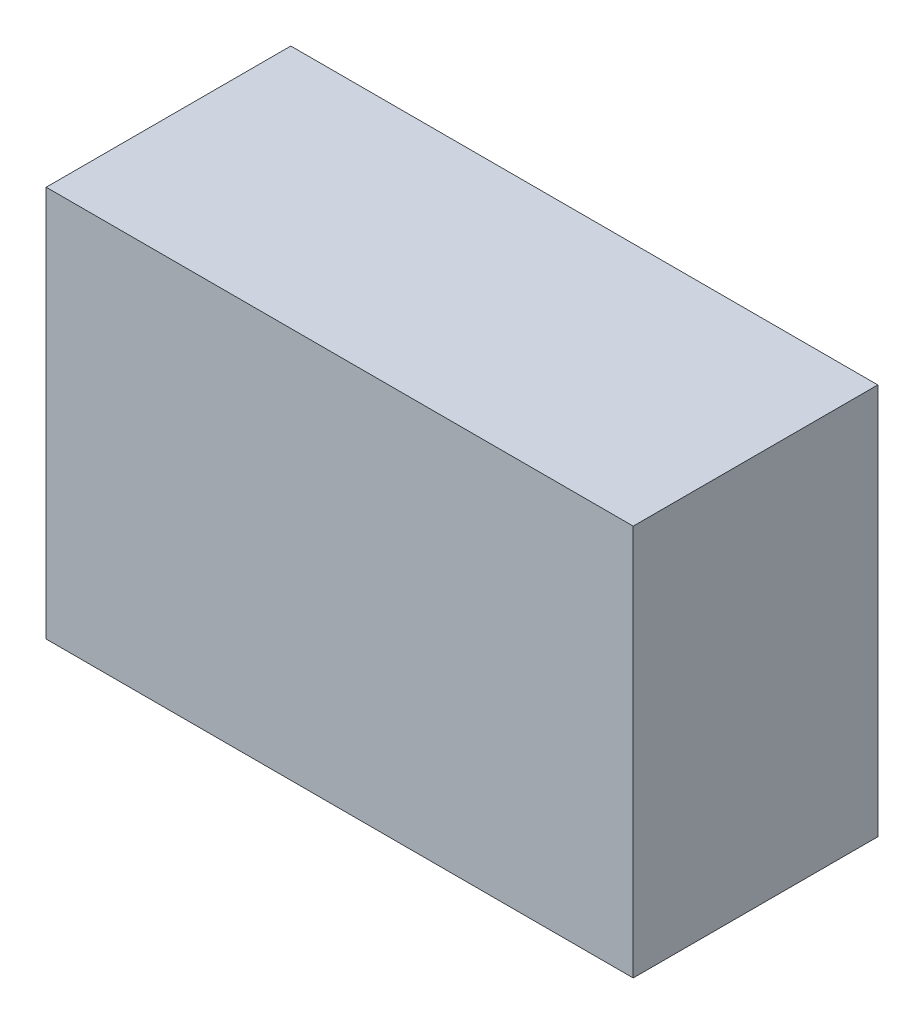
ISO-10303-21;
HEADER;
FILE_DESCRIPTION(('STEP AP214'),'2;1');
FILE_NAME('part.step','',(''),(''),'','','');
FILE_SCHEMA(('AUTOMOTIVE_DESIGN { 1 0 10303 214 1 1 1 1 }'));
ENDSEC;
DATA;
#1=APPLICATION_CONTEXT('core data for automotive mechanical design processes');
#2=APPLICATION_PROTOCOL_DEFINITION('international standard','automotive_design',2000,#1);
#3=PRODUCT_CONTEXT('',#1,'mechanical');
#4=PRODUCT('Part','Part','',(#3));
#5=PRODUCT_RELATED_PRODUCT_CATEGORY('part','',(#4));
#6=PRODUCT_DEFINITION_FORMATION('','',#4);
#7=PRODUCT_DEFINITION_CONTEXT('part definition',#1,'design');
#8=PRODUCT_DEFINITION('design','',#6,#7);
#9=PRODUCT_DEFINITION_SHAPE('','',#8);
#10=(LENGTH_UNIT() NAMED_UNIT(*) SI_UNIT(.MILLI.,.METRE.));
#11=(NAMED_UNIT(*) PLANE_ANGLE_UNIT() SI_UNIT($,.RADIAN.));
#12=(NAMED_UNIT(*) SI_UNIT($,.STERADIAN.) SOLID_ANGLE_UNIT());
#13=UNCERTAINTY_MEASURE_WITH_UNIT(LENGTH_MEASURE(1.E-05),#10,'distance_accuracy_value','');
#14=(GEOMETRIC_REPRESENTATION_CONTEXT(3) GLOBAL_UNCERTAINTY_ASSIGNED_CONTEXT((#13)) GLOBAL_UNIT_ASSIGNED_CONTEXT((#10,
#11,#12)) REPRESENTATION_CONTEXT('',''));
#15=CARTESIAN_POINT('',(0.,0.,0.));
#16=DIRECTION('',(0.,0.,1.));
#17=DIRECTION('',(1.,0.,0.));
#18=AXIS2_PLACEMENT_3D('',#15,#16,#17);
#19=CARTESIAN_POINT('',(0.,0.,25.));
#20=DIRECTION('',(-1.,0.,0.));
#21=DIRECTION('',(0.,0.,1.));
#22=AXIS2_PLACEMENT_3D('',#19,#20,#21);
#23=PLANE('',#22);
#24=DIRECTION('',(0.,1.,0.));
#25=VECTOR('',#24,1.);
#26=CARTESIAN_POINT('',(0.,0.,0.));
#27=LINE('',#26,#25);
#28=CARTESIAN_POINT('',(0.,0.,0.));
#29=VERTEX_POINT('',#28);
#30=CARTESIAN_POINT('',(0.,40.,0.));
#31=VERTEX_POINT('',#30);
#32=EDGE_CURVE('E93',#29,#31,#27,.T.);
#33=ORIENTED_EDGE('',*,*,#32,.T.);
#34=DIRECTION('',(0.,0.,-1.));
#35=VECTOR('',#34,1.);
#36=CARTESIAN_POINT('',(0.,40.,25.));
#37=LINE('',#36,#35);
#38=CARTESIAN_POINT('',(0.,40.,25.));
#39=VERTEX_POINT('',#38);
#40=EDGE_CURVE('E11',#39,#31,#37,.T.);
#41=ORIENTED_EDGE('',*,*,#40,.F.);
#42=DIRECTION('',(0.,1.,0.));
#43=VECTOR('',#42,1.);
#44=CARTESIAN_POINT('',(0.,0.,25.));
#45=LINE('',#44,#43);
#46=CARTESIAN_POINT('',(0.,0.,25.));
#47=VERTEX_POINT('',#46);
#48=EDGE_CURVE('E81',#47,#39,#45,.T.);
#49=ORIENTED_EDGE('',*,*,#48,.F.);
#50=DIRECTION('',(0.,0.,-1.));
#51=VECTOR('',#50,1.);
#52=CARTESIAN_POINT('',(0.,0.,25.));
#53=LINE('',#52,#51);
#54=EDGE_CURVE('E89',#47,#29,#53,.T.);
#55=ORIENTED_EDGE('',*,*,#54,.T.);
#56=EDGE_LOOP('',(#33,#41,#49,#55));
#57=FACE_BOUND('',#56,.T.);
#58=ADVANCED_FACE('F30',(#57),#23,.F.);
#59=CARTESIAN_POINT('',(0.,40.,25.));
#60=DIRECTION('',(0.,-1.,0.));
#61=DIRECTION('',(1.,0.,0.));
#62=AXIS2_PLACEMENT_3D('',#59,#60,#61);
#63=PLANE('',#62);
#64=DIRECTION('',(-1.,0.,0.));
#65=VECTOR('',#64,1.);
#66=CARTESIAN_POINT('',(0.,40.,0.));
#67=LINE('',#66,#65);
#68=CARTESIAN_POINT('',(-60.,40.,0.));
#69=VERTEX_POINT('',#68);
#70=EDGE_CURVE('E85',#31,#69,#67,.T.);
#71=ORIENTED_EDGE('',*,*,#70,.T.);
#72=DIRECTION('',(0.,0.,-1.));
#73=VECTOR('',#72,1.);
#74=CARTESIAN_POINT('',(-60.,40.,25.));
#75=LINE('',#74,#73);
#76=CARTESIAN_POINT('',(-60.,40.,25.));
#77=VERTEX_POINT('',#76);
#78=EDGE_CURVE('E38',#77,#69,#75,.T.);
#79=ORIENTED_EDGE('',*,*,#78,.F.);
#80=DIRECTION('',(-1.,0.,0.));
#81=VECTOR('',#80,1.);
#82=CARTESIAN_POINT('',(0.,40.,25.));
#83=LINE('',#82,#81);
#84=EDGE_CURVE('E76',#39,#77,#83,.T.);
#85=ORIENTED_EDGE('',*,*,#84,.F.);
#86=ORIENTED_EDGE('',*,*,#40,.T.);
#87=EDGE_LOOP('',(#71,#79,#85,#86));
#88=FACE_BOUND('',#87,.T.);
#89=ADVANCED_FACE('F84',(#88),#63,.F.);
#90=CARTESIAN_POINT('',(-60.,0.,25.));
#91=DIRECTION('',(1.,0.,0.));
#92=DIRECTION('',(0.,0.,-1.));
#93=AXIS2_PLACEMENT_3D('',#90,#91,#92);
#94=PLANE('',#93);
#95=DIRECTION('',(0.,-1.,0.));
#96=VECTOR('',#95,1.);
#97=CARTESIAN_POINT('',(-60.,0.,0.));
#98=LINE('',#97,#96);
#99=CARTESIAN_POINT('',(-60.,0.,0.));
#100=VERTEX_POINT('',#99);
#101=EDGE_CURVE('E63',#69,#100,#98,.T.);
#102=ORIENTED_EDGE('',*,*,#101,.T.);
#103=DIRECTION('',(0.,0.,-1.));
#104=VECTOR('',#103,1.);
#105=CARTESIAN_POINT('',(-60.,0.,25.));
#106=LINE('',#105,#104);
#107=CARTESIAN_POINT('',(-60.,0.,25.));
#108=VERTEX_POINT('',#107);
#109=EDGE_CURVE('E86',#108,#100,#106,.T.);
#110=ORIENTED_EDGE('',*,*,#109,.F.);
#111=DIRECTION('',(0.,-1.,0.));
#112=VECTOR('',#111,1.);
#113=CARTESIAN_POINT('',(-60.,0.,25.));
#114=LINE('',#113,#112);
#115=EDGE_CURVE('E79',#77,#108,#114,.T.);
#116=ORIENTED_EDGE('',*,*,#115,.F.);
#117=ORIENTED_EDGE('',*,*,#78,.T.);
#118=EDGE_LOOP('',(#102,#110,#116,#117));
#119=FACE_BOUND('',#118,.T.);
#120=ADVANCED_FACE('F87',(#119),#94,.F.);
#121=CARTESIAN_POINT('',(0.,0.,25.));
#122=DIRECTION('',(0.,1.,0.));
#123=DIRECTION('',(-1.,0.,0.));
#124=AXIS2_PLACEMENT_3D('',#121,#122,#123);
#125=PLANE('',#124);
#126=DIRECTION('',(1.,0.,0.));
#127=VECTOR('',#126,1.);
#128=CARTESIAN_POINT('',(0.,0.,0.));
#129=LINE('',#128,#127);
#130=EDGE_CURVE('E69',#100,#29,#129,.T.);
#131=ORIENTED_EDGE('',*,*,#130,.T.);
#132=ORIENTED_EDGE('',*,*,#54,.F.);
#133=DIRECTION('',(1.,0.,0.));
#134=VECTOR('',#133,1.);
#135=CARTESIAN_POINT('',(0.,0.,25.));
#136=LINE('',#135,#134);
#137=EDGE_CURVE('E46',#108,#47,#136,.T.);
#138=ORIENTED_EDGE('',*,*,#137,.F.);
#139=ORIENTED_EDGE('',*,*,#109,.T.);
#140=EDGE_LOOP('',(#131,#132,#138,#139));
#141=FACE_BOUND('',#140,.T.);
#142=ADVANCED_FACE('F100',(#141),#125,.F.);
#143=CARTESIAN_POINT('',(0.,40.,25.));
#144=DIRECTION('',(0.,0.,1.));
#145=DIRECTION('',(1.,0.,0.));
#146=AXIS2_PLACEMENT_3D('',#143,#144,#145);
#147=PLANE('',#146);
#148=ORIENTED_EDGE('',*,*,#48,.T.);
#149=ORIENTED_EDGE('',*,*,#84,.T.);
#150=ORIENTED_EDGE('',*,*,#115,.T.);
#151=ORIENTED_EDGE('',*,*,#137,.T.);
#152=EDGE_LOOP('',(#148,#149,#150,#151));
#153=FACE_BOUND('',#152,.T.);
#154=ADVANCED_FACE('F77',(#153),#147,.T.);
#155=CARTESIAN_POINT('',(0.,40.,0.));
#156=DIRECTION('',(0.,0.,1.));
#157=DIRECTION('',(1.,0.,0.));
#158=AXIS2_PLACEMENT_3D('',#155,#156,#157);
#159=PLANE('',#158);
#160=ORIENTED_EDGE('',*,*,#32,.F.);
#161=ORIENTED_EDGE('',*,*,#130,.F.);
#162=ORIENTED_EDGE('',*,*,#101,.F.);
#163=ORIENTED_EDGE('',*,*,#70,.F.);
#164=EDGE_LOOP('',(#160,#161,#162,#163));
#165=FACE_BOUND('',#164,.T.);
#166=ADVANCED_FACE('F103',(#165),#159,.F.);
#167=CLOSED_SHELL('',(#58,#89,#120,#142,#154,#166));
#168=MANIFOLD_SOLID_BREP('B2',#167);
#169=ADVANCED_BREP_SHAPE_REPRESENTATION('',(#18,#168),#14);
#170=SHAPE_DEFINITION_REPRESENTATION(#9,#169);
ENDSEC;
END-ISO-10303-21;
